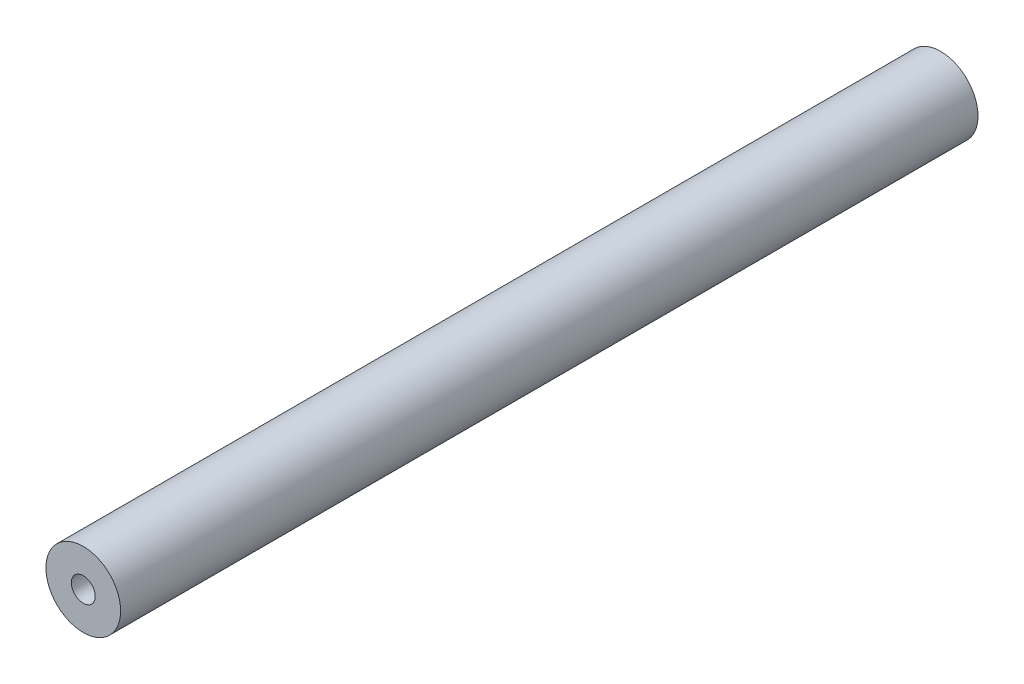
ISO-10303-21;
HEADER;
FILE_DESCRIPTION(('STEP AP214'),'2;1');
FILE_NAME('part.step','',(''),(''),'','','');
FILE_SCHEMA(('AUTOMOTIVE_DESIGN { 1 0 10303 214 1 1 1 1 }'));
ENDSEC;
DATA;
#1=APPLICATION_CONTEXT('core data for automotive mechanical design processes');
#2=APPLICATION_PROTOCOL_DEFINITION('international standard','automotive_design',2000,#1);
#3=PRODUCT_CONTEXT('',#1,'mechanical');
#4=PRODUCT('Part','Part','',(#3));
#5=PRODUCT_RELATED_PRODUCT_CATEGORY('part','',(#4));
#6=PRODUCT_DEFINITION_FORMATION('','',#4);
#7=PRODUCT_DEFINITION_CONTEXT('part definition',#1,'design');
#8=PRODUCT_DEFINITION('design','',#6,#7);
#9=PRODUCT_DEFINITION_SHAPE('','',#8);
#10=(LENGTH_UNIT() NAMED_UNIT(*) SI_UNIT(.MILLI.,.METRE.));
#11=(NAMED_UNIT(*) PLANE_ANGLE_UNIT() SI_UNIT($,.RADIAN.));
#12=(NAMED_UNIT(*) SI_UNIT($,.STERADIAN.) SOLID_ANGLE_UNIT());
#13=UNCERTAINTY_MEASURE_WITH_UNIT(LENGTH_MEASURE(1.E-05),#10,'distance_accuracy_value','');
#14=(GEOMETRIC_REPRESENTATION_CONTEXT(3) GLOBAL_UNCERTAINTY_ASSIGNED_CONTEXT((#13)) GLOBAL_UNIT_ASSIGNED_CONTEXT((#10,
#11,#12)) REPRESENTATION_CONTEXT('',''));
#15=CARTESIAN_POINT('',(0.,0.,0.));
#16=DIRECTION('',(0.,0.,1.));
#17=DIRECTION('',(1.,0.,0.));
#18=AXIS2_PLACEMENT_3D('',#15,#16,#17);
#19=CARTESIAN_POINT('',(0.,0.,287.));
#20=DIRECTION('',(0.,0.,-1.));
#21=DIRECTION('',(-1.,0.,0.));
#22=AXIS2_PLACEMENT_3D('',#19,#20,#21);
#23=CYLINDRICAL_SURFACE('',#22,12.5);
#24=CARTESIAN_POINT('',(0.,0.,287.));
#25=DIRECTION('',(0.,0.,1.));
#26=DIRECTION('',(1.,0.,0.));
#27=AXIS2_PLACEMENT_3D('',#24,#25,#26);
#28=CIRCLE('',#27,12.5);
#29=CARTESIAN_POINT('',(12.5,0.,287.));
#30=VERTEX_POINT('',#29);
#31=EDGE_CURVE('E10',#30,#30,#28,.T.);
#32=ORIENTED_EDGE('',*,*,#31,.F.);
#33=EDGE_LOOP('',(#32));
#34=FACE_BOUND('',#33,.T.);
#35=CARTESIAN_POINT('',(0.,0.,0.));
#36=DIRECTION('',(0.,0.,1.));
#37=DIRECTION('',(1.,0.,0.));
#38=AXIS2_PLACEMENT_3D('',#35,#36,#37);
#39=CIRCLE('',#38,12.5);
#40=CARTESIAN_POINT('',(12.5,0.,0.));
#41=VERTEX_POINT('',#40);
#42=EDGE_CURVE('E34',#41,#41,#39,.T.);
#43=ORIENTED_EDGE('',*,*,#42,.T.);
#44=EDGE_LOOP('',(#43));
#45=FACE_BOUND('',#44,.T.);
#46=ADVANCED_FACE('F31',(#34,#45),#23,.T.);
#47=CARTESIAN_POINT('',(0.,0.,287.));
#48=DIRECTION('',(0.,0.,1.));
#49=DIRECTION('',(1.,0.,0.));
#50=AXIS2_PLACEMENT_3D('',#47,#48,#49);
#51=PLANE('',#50);
#52=CARTESIAN_POINT('',(0.,0.,287.));
#53=DIRECTION('',(0.,0.,1.));
#54=DIRECTION('',(1.,0.,0.));
#55=AXIS2_PLACEMENT_3D('',#52,#53,#54);
#56=CIRCLE('',#55,4.);
#57=CARTESIAN_POINT('',(-4.,0.,287.));
#58=VERTEX_POINT('',#57);
#59=EDGE_CURVE('E41',#58,#58,#56,.F.);
#60=ORIENTED_EDGE('',*,*,#59,.T.);
#61=EDGE_LOOP('',(#60));
#62=FACE_BOUND('',#61,.T.);
#63=ORIENTED_EDGE('',*,*,#31,.T.);
#64=EDGE_LOOP('',(#63));
#65=FACE_BOUND('',#64,.T.);
#66=ADVANCED_FACE('F59',(#62,#65),#51,.T.);
#67=CARTESIAN_POINT('',(0.,0.,0.));
#68=DIRECTION('',(0.,0.,1.));
#69=DIRECTION('',(1.,0.,0.));
#70=AXIS2_PLACEMENT_3D('',#67,#68,#69);
#71=PLANE('',#70);
#72=CARTESIAN_POINT('',(0.,0.,0.));
#73=DIRECTION('',(0.,0.,1.));
#74=DIRECTION('',(1.,0.,0.));
#75=AXIS2_PLACEMENT_3D('',#72,#73,#74);
#76=CIRCLE('',#75,4.);
#77=CARTESIAN_POINT('',(-4.,0.,0.));
#78=VERTEX_POINT('',#77);
#79=EDGE_CURVE('E45',#78,#78,#76,.T.);
#80=ORIENTED_EDGE('',*,*,#79,.T.);
#81=EDGE_LOOP('',(#80));
#82=FACE_BOUND('',#81,.T.);
#83=ORIENTED_EDGE('',*,*,#42,.F.);
#84=EDGE_LOOP('',(#83));
#85=FACE_BOUND('',#84,.T.);
#86=ADVANCED_FACE('F49',(#82,#85),#71,.F.);
#87=CARTESIAN_POINT('',(0.,0.,395.));
#88=DIRECTION('',(0.,0.,-1.));
#89=DIRECTION('',(-1.,0.,0.));
#90=AXIS2_PLACEMENT_3D('',#87,#88,#89);
#91=CYLINDRICAL_SURFACE('',#90,4.);
#92=CARTESIAN_POINT('',(-4.,0.,287.));
#93=CARTESIAN_POINT('',(-4.,0.,284.010416666667));
#94=CARTESIAN_POINT('',(-4.,0.,281.020833333333));
#95=CARTESIAN_POINT('',(-4.,0.,275.041666666667));
#96=CARTESIAN_POINT('',(-4.,0.,272.052083333333));
#97=CARTESIAN_POINT('',(-4.,0.,266.072916666667));
#98=CARTESIAN_POINT('',(-4.,0.,263.083333333333));
#99=CARTESIAN_POINT('',(-4.,0.,257.104166666667));
#100=CARTESIAN_POINT('',(-4.,0.,254.114583333333));
#101=CARTESIAN_POINT('',(-4.,0.,248.135416666667));
#102=CARTESIAN_POINT('',(-4.,0.,245.145833333333));
#103=CARTESIAN_POINT('',(-4.,0.,239.166666666667));
#104=CARTESIAN_POINT('',(-4.,0.,236.177083333333));
#105=CARTESIAN_POINT('',(-4.,0.,230.197916666667));
#106=CARTESIAN_POINT('',(-4.,0.,227.208333333333));
#107=CARTESIAN_POINT('',(-4.,0.,221.229166666667));
#108=CARTESIAN_POINT('',(-4.,0.,218.239583333333));
#109=CARTESIAN_POINT('',(-4.,0.,212.260416666667));
#110=CARTESIAN_POINT('',(-4.,0.,209.270833333333));
#111=CARTESIAN_POINT('',(-4.,0.,203.291666666667));
#112=CARTESIAN_POINT('',(-4.,0.,200.302083333333));
#113=CARTESIAN_POINT('',(-4.,0.,194.322916666667));
#114=CARTESIAN_POINT('',(-4.,0.,191.333333333333));
#115=CARTESIAN_POINT('',(-4.,0.,185.354166666667));
#116=CARTESIAN_POINT('',(-4.,0.,182.364583333333));
#117=CARTESIAN_POINT('',(-4.,0.,176.385416666667));
#118=CARTESIAN_POINT('',(-4.,0.,173.395833333333));
#119=CARTESIAN_POINT('',(-4.,0.,167.416666666667));
#120=CARTESIAN_POINT('',(-4.,0.,164.427083333333));
#121=CARTESIAN_POINT('',(-4.,0.,158.447916666667));
#122=CARTESIAN_POINT('',(-4.,0.,155.458333333333));
#123=CARTESIAN_POINT('',(-4.,0.,149.479166666667));
#124=CARTESIAN_POINT('',(-4.,0.,146.489583333333));
#125=CARTESIAN_POINT('',(-4.,0.,140.510416666667));
#126=CARTESIAN_POINT('',(-4.,0.,137.520833333333));
#127=CARTESIAN_POINT('',(-4.,0.,131.541666666667));
#128=CARTESIAN_POINT('',(-4.,0.,128.552083333333));
#129=CARTESIAN_POINT('',(-4.,0.,122.572916666667));
#130=CARTESIAN_POINT('',(-4.,0.,119.583333333333));
#131=CARTESIAN_POINT('',(-4.,0.,113.604166666667));
#132=CARTESIAN_POINT('',(-4.,0.,110.614583333333));
#133=CARTESIAN_POINT('',(-4.,0.,104.635416666667));
#134=CARTESIAN_POINT('',(-4.,0.,101.645833333333));
#135=CARTESIAN_POINT('',(-4.,0.,95.6666666666666));
#136=CARTESIAN_POINT('',(-4.,0.,92.6770833333333));
#137=CARTESIAN_POINT('',(-4.,0.,86.6979166666667));
#138=CARTESIAN_POINT('',(-4.,0.,83.7083333333333));
#139=CARTESIAN_POINT('',(-4.,0.,77.7291666666667));
#140=CARTESIAN_POINT('',(-4.,0.,74.7395833333333));
#141=CARTESIAN_POINT('',(-4.,0.,68.7604166666666));
#142=CARTESIAN_POINT('',(-4.,0.,65.7708333333333));
#143=CARTESIAN_POINT('',(-4.,0.,59.7916666666666));
#144=CARTESIAN_POINT('',(-4.,0.,56.8020833333333));
#145=CARTESIAN_POINT('',(-4.,0.,50.8229166666667));
#146=CARTESIAN_POINT('',(-4.,0.,47.8333333333333));
#147=CARTESIAN_POINT('',(-4.,0.,41.8541666666667));
#148=CARTESIAN_POINT('',(-4.,0.,38.8645833333333));
#149=CARTESIAN_POINT('',(-4.,0.,32.8854166666666));
#150=CARTESIAN_POINT('',(-4.,0.,29.8958333333333));
#151=CARTESIAN_POINT('',(-4.,0.,23.9166666666666));
#152=CARTESIAN_POINT('',(-4.,0.,20.9270833333333));
#153=CARTESIAN_POINT('',(-4.,0.,14.9479166666667));
#154=CARTESIAN_POINT('',(-4.,0.,11.9583333333333));
#155=CARTESIAN_POINT('',(-4.,0.,5.97916666666667));
#156=CARTESIAN_POINT('',(-4.,0.,2.9895833333333));
#157=CARTESIAN_POINT('',(-4.,0.,0.));
#158=B_SPLINE_CURVE_WITH_KNOTS('',3,(#92,#93,#94,#95,#96,#97,#98,#99,#100,#101,#102,#103,#104,
#105,#106,#107,#108,#109,#110,#111,#112,#113,#114,#115,#116,#117,#118,#119,#120,#121,#122,#123,
#124,#125,#126,#127,#128,#129,#130,#131,#132,#133,#134,#135,#136,#137,#138,#139,#140,#141,#142,
#143,#144,#145,#146,#147,#148,#149,#150,#151,#152,#153,#154,#155,#156,#157),.UNSPECIFIED.,.F.,
.F.,(4,2,2,2,2,2,2,2,2,2,2,2,2,2,2,2,2,2,2,2,2,2,2,2,2,2,2,2,2,2,2,2,4),(0.,8.96875000000002,
17.9375,26.90625,35.875,44.84375,53.8125,62.78125,71.75,80.71875,89.6875,98.65625,107.625,
116.59375,125.5625,134.53125,143.5,152.46875,161.4375,170.40625,179.375,188.34375,197.3125,
206.28125,215.25,224.21875,233.1875,242.15625,251.125,260.09375,269.0625,278.03125,287.),.UNSPECIFIED.);
#159=EDGE_CURVE('BSEAM52',#58,#78,#158,.T.);
#160=ORIENTED_EDGE('',*,*,#59,.F.);
#161=ORIENTED_EDGE('',*,*,#79,.F.);
#162=ORIENTED_EDGE('',*,*,#159,.T.);
#163=ORIENTED_EDGE('',*,*,#159,.F.);
#164=EDGE_LOOP('',(#160,#162,#161,#163));
#165=FACE_BOUND('',#164,.T.);
#166=ADVANCED_FACE('F52',(#165),#91,.F.);
#167=CLOSED_SHELL('',(#46,#66,#86,#166));
#168=MANIFOLD_SOLID_BREP('B2',#167);
#169=ADVANCED_BREP_SHAPE_REPRESENTATION('',(#18,#168),#14);
#170=SHAPE_DEFINITION_REPRESENTATION(#9,#169);
ENDSEC;
END-ISO-10303-21;
